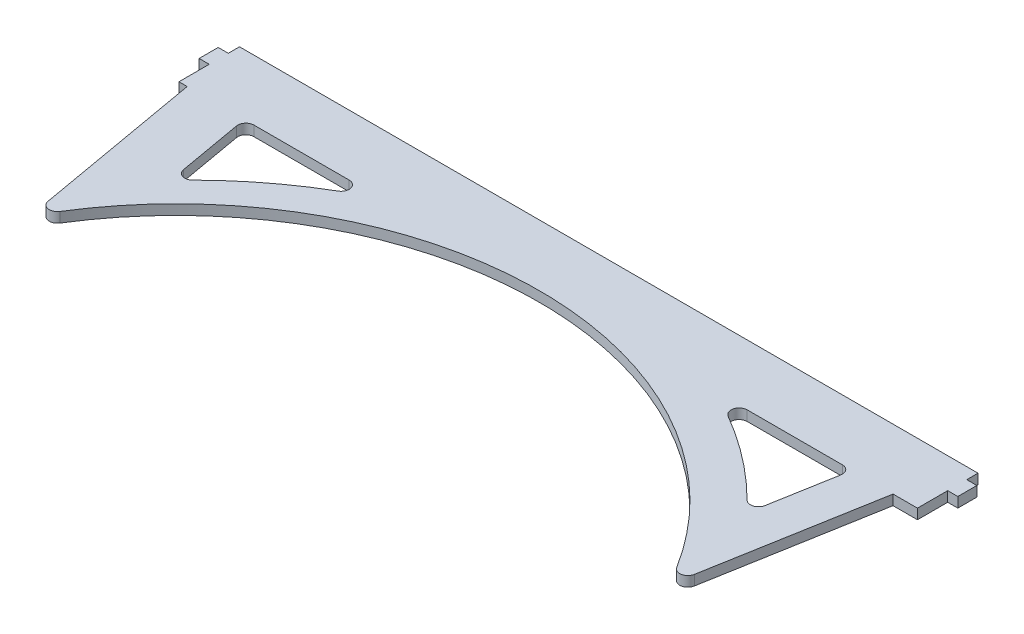
ISO-10303-21;
HEADER;
FILE_DESCRIPTION(('STEP AP214'),'2;1');
FILE_NAME('part.step','',(''),(''),'','','');
FILE_SCHEMA(('AUTOMOTIVE_DESIGN { 1 0 10303 214 1 1 1 1 }'));
ENDSEC;
DATA;
#1=APPLICATION_CONTEXT('core data for automotive mechanical design processes');
#2=APPLICATION_PROTOCOL_DEFINITION('international standard','automotive_design',2000,#1);
#3=PRODUCT_CONTEXT('',#1,'mechanical');
#4=PRODUCT('Part','Part','',(#3));
#5=PRODUCT_RELATED_PRODUCT_CATEGORY('part','',(#4));
#6=PRODUCT_DEFINITION_FORMATION('','',#4);
#7=PRODUCT_DEFINITION_CONTEXT('part definition',#1,'design');
#8=PRODUCT_DEFINITION('design','',#6,#7);
#9=PRODUCT_DEFINITION_SHAPE('','',#8);
#10=(LENGTH_UNIT() NAMED_UNIT(*) SI_UNIT(.MILLI.,.METRE.));
#11=(NAMED_UNIT(*) PLANE_ANGLE_UNIT() SI_UNIT($,.RADIAN.));
#12=(NAMED_UNIT(*) SI_UNIT($,.STERADIAN.) SOLID_ANGLE_UNIT());
#13=UNCERTAINTY_MEASURE_WITH_UNIT(LENGTH_MEASURE(1.E-05),#10,'distance_accuracy_value','');
#14=(GEOMETRIC_REPRESENTATION_CONTEXT(3) GLOBAL_UNCERTAINTY_ASSIGNED_CONTEXT((#13)) GLOBAL_UNIT_ASSIGNED_CONTEXT((#10,
#11,#12)) REPRESENTATION_CONTEXT('',''));
#15=CARTESIAN_POINT('',(0.,0.,0.));
#16=DIRECTION('',(0.,0.,1.));
#17=DIRECTION('',(1.,0.,0.));
#18=AXIS2_PLACEMENT_3D('',#15,#16,#17);
#19=CARTESIAN_POINT('',(333.375,3.175,9.52499999999996));
#20=DIRECTION('',(0.,0.,1.));
#21=DIRECTION('',(1.,0.,0.));
#22=AXIS2_PLACEMENT_3D('',#19,#20,#21);
#23=PLANE('',#22);
#24=DIRECTION('',(0.,1.,0.));
#25=VECTOR('',#24,1.);
#26=CARTESIAN_POINT('',(-113.550225532945,-229.971988758317,9.52499999999996));
#27=LINE('',#26,#25);
#28=CARTESIAN_POINT('',(-113.550225532945,0.,9.52500000000002));
#29=VERTEX_POINT('',#28);
#30=CARTESIAN_POINT('',(-113.550225532945,3.175,9.52499999999996));
#31=VERTEX_POINT('',#30);
#32=EDGE_CURVE('E435',#29,#31,#27,.T.);
#33=ORIENTED_EDGE('',*,*,#32,.T.);
#34=DIRECTION('',(-1.,0.,0.));
#35=VECTOR('',#34,1.);
#36=CARTESIAN_POINT('',(333.375,3.175,9.52499999999996));
#37=LINE('',#36,#35);
#38=CARTESIAN_POINT('',(-116.1415,3.175,9.52499999999996));
#39=VERTEX_POINT('',#38);
#40=EDGE_CURVE('E493',#31,#39,#37,.T.);
#41=ORIENTED_EDGE('',*,*,#40,.T.);
#42=DIRECTION('',(0.,-1.,0.));
#43=VECTOR('',#42,1.);
#44=CARTESIAN_POINT('',(-116.1415,3.175,9.52499999999996));
#45=LINE('',#44,#43);
#46=CARTESIAN_POINT('',(-116.1415,0.,9.52499999999996));
#47=VERTEX_POINT('',#46);
#48=EDGE_CURVE('E477',#39,#47,#45,.T.);
#49=ORIENTED_EDGE('',*,*,#48,.T.);
#50=DIRECTION('',(-1.,0.,0.));
#51=VECTOR('',#50,1.);
#52=CARTESIAN_POINT('',(333.375,0.,9.52499999999996));
#53=LINE('',#52,#51);
#54=EDGE_CURVE('E481',#29,#47,#53,.T.);
#55=ORIENTED_EDGE('',*,*,#54,.F.);
#56=EDGE_LOOP('',(#33,#41,#49,#55));
#57=FACE_BOUND('',#56,.T.);
#58=ADVANCED_FACE('F41',(#57),#23,.T.);
#59=DIRECTION('',(0.,1.,0.));
#60=VECTOR('',#59,1.);
#61=CARTESIAN_POINT('',(108.47022553296,-229.971988758317,9.52499999999996));
#62=LINE('',#61,#60);
#63=CARTESIAN_POINT('',(108.47022553296,0.,9.52499999999996));
#64=VERTEX_POINT('',#63);
#65=CARTESIAN_POINT('',(108.47022553296,3.175,9.52499999999996));
#66=VERTEX_POINT('',#65);
#67=EDGE_CURVE('E428',#64,#66,#62,.T.);
#68=ORIENTED_EDGE('',*,*,#67,.F.);
#69=CARTESIAN_POINT('',(116.1415,0.,9.52499999999999));
#70=VERTEX_POINT('',#69);
#71=EDGE_CURVE('E498',#70,#64,#53,.T.);
#72=ORIENTED_EDGE('',*,*,#71,.F.);
#73=DIRECTION('',(0.,-1.,0.));
#74=VECTOR('',#73,1.);
#75=CARTESIAN_POINT('',(116.1415,3.175,9.52499999999996));
#76=LINE('',#75,#74);
#77=CARTESIAN_POINT('',(116.1415,3.175,9.52499999999996));
#78=VERTEX_POINT('',#77);
#79=EDGE_CURVE('E447',#78,#70,#76,.T.);
#80=ORIENTED_EDGE('',*,*,#79,.F.);
#81=EDGE_CURVE('E488',#78,#66,#37,.T.);
#82=ORIENTED_EDGE('',*,*,#81,.T.);
#83=EDGE_LOOP('',(#68,#72,#80,#82));
#84=FACE_BOUND('',#83,.T.);
#85=ADVANCED_FACE('F546',(#84),#23,.T.);
#86=CARTESIAN_POINT('',(0.,3.175,0.));
#87=DIRECTION('',(0.,-1.,0.));
#88=DIRECTION('',(0.,0.,-1.));
#89=AXIS2_PLACEMENT_3D('',#86,#87,#88);
#90=PLANE('',#89);
#91=CARTESIAN_POINT('',(88.9711827002063,3.175,32.3459049542351));
#92=DIRECTION('',(0.,1.,0.));
#93=DIRECTION('',(0.,0.,1.));
#94=AXIS2_PLACEMENT_3D('',#91,#92,#93);
#95=CIRCLE('',#94,2.54);
#96=CARTESIAN_POINT('',(87.1768457845161,3.175,34.143668852246));
#97=VERTEX_POINT('',#96);
#98=CARTESIAN_POINT('',(91.4725943928573,3.175,32.7869713255091));
#99=VERTEX_POINT('',#98);
#100=EDGE_CURVE('E310',#97,#99,#95,.T.);
#101=ORIENTED_EDGE('',*,*,#100,.F.);
#102=CARTESIAN_POINT('',(-2.53999999999222,3.175,124.031863752793));
#103=DIRECTION('',(0.,-1.,0.));
#104=DIRECTION('',(0.,0.,1.));
#105=AXIS2_PLACEMENT_3D('',#102,#103,#104);
#106=CIRCLE('',#105,127.);
#107=CARTESIAN_POINT('',(61.328866019984,3.175,14.2604287010351));
#108=VERTEX_POINT('',#107);
#109=EDGE_CURVE('E307',#108,#97,#106,.T.);
#110=ORIENTED_EDGE('',*,*,#109,.F.);
#111=CARTESIAN_POINT('',(62.6062433403835,3.175,12.065));
#112=DIRECTION('',(0.,1.,0.));
#113=DIRECTION('',(0.,0.,-1.));
#114=AXIS2_PLACEMENT_3D('',#111,#112,#113);
#115=CIRCLE('',#114,2.53999999999999);
#116=CARTESIAN_POINT('',(62.6062433403835,3.175,9.52499999999996));
#117=VERTEX_POINT('',#116);
#118=EDGE_CURVE('E286',#117,#108,#115,.T.);
#119=ORIENTED_EDGE('',*,*,#118,.F.);
#120=DIRECTION('',(-1.,0.,0.));
#121=VECTOR('',#120,1.);
#122=CARTESIAN_POINT('',(92.5472534368218,3.175,9.52499999999996));
#123=LINE('',#122,#121);
#124=CARTESIAN_POINT('',(92.5472534368218,3.175,9.52499999999996));
#125=VERTEX_POINT('',#124);
#126=EDGE_CURVE('E323',#125,#117,#123,.T.);
#127=ORIENTED_EDGE('',*,*,#126,.F.);
#128=CARTESIAN_POINT('',(92.5472534368219,3.175,12.065));
#129=DIRECTION('',(0.,1.,0.));
#130=DIRECTION('',(0.,0.,-1.));
#131=AXIS2_PLACEMENT_3D('',#128,#129,#130);
#132=CIRCLE('',#131,2.54);
#133=CARTESIAN_POINT('',(95.0486651294729,3.175,12.506066371274));
#134=VERTEX_POINT('',#133);
#135=EDGE_CURVE('E319',#134,#125,#132,.T.);
#136=ORIENTED_EDGE('',*,*,#135,.F.);
#137=DIRECTION('',(0.173648177666927,0.,-0.984807753012209));
#138=VECTOR('',#137,1.);
#139=CARTESIAN_POINT('',(91.4725943928573,3.175,32.7869713255091));
#140=LINE('',#139,#138);
#141=EDGE_CURVE('E315',#99,#134,#140,.T.);
#142=ORIENTED_EDGE('',*,*,#141,.F.);
#143=EDGE_LOOP('',(#101,#110,#119,#127,#136,#142));
#144=FACE_BOUND('',#143,.T.);
#145=CARTESIAN_POINT('',(-62.6062433403835,3.175,12.0649999999997));
#146=DIRECTION('',(0.,1.,0.));
#147=DIRECTION('',(0.,0.,1.));
#148=AXIS2_PLACEMENT_3D('',#145,#146,#147);
#149=CIRCLE('',#148,2.53999999999999);
#150=CARTESIAN_POINT('',(-61.3288660199839,3.175,14.2604287010348));
#151=VERTEX_POINT('',#150);
#152=CARTESIAN_POINT('',(-62.6062433403835,3.175,9.52499999999969));
#153=VERTEX_POINT('',#152);
#154=EDGE_CURVE('E269',#151,#153,#149,.T.);
#155=ORIENTED_EDGE('',*,*,#154,.F.);
#156=CARTESIAN_POINT('',(2.53999999999177,3.175,124.031863752793));
#157=DIRECTION('',(0.,-1.,0.));
#158=DIRECTION('',(0.,0.,-1.));
#159=AXIS2_PLACEMENT_3D('',#156,#157,#158);
#160=CIRCLE('',#159,127.);
#161=CARTESIAN_POINT('',(-87.1768457845162,3.175,34.1436688522457));
#162=VERTEX_POINT('',#161);
#163=EDGE_CURVE('E264',#162,#151,#160,.T.);
#164=ORIENTED_EDGE('',*,*,#163,.F.);
#165=CARTESIAN_POINT('',(-88.9711827002064,3.175,32.3459049542347));
#166=DIRECTION('',(0.,1.,0.));
#167=DIRECTION('',(0.,0.,-1.));
#168=AXIS2_PLACEMENT_3D('',#165,#166,#167);
#169=CIRCLE('',#168,2.53999999999999);
#170=CARTESIAN_POINT('',(-91.4725943928573,3.175,32.7869713255091));
#171=VERTEX_POINT('',#170);
#172=EDGE_CURVE('E354',#171,#162,#169,.T.);
#173=ORIENTED_EDGE('',*,*,#172,.F.);
#174=DIRECTION('',(0.173648177666928,0.,0.984807753012208));
#175=VECTOR('',#174,1.);
#176=CARTESIAN_POINT('',(-91.4725943928573,3.175,32.7869713255091));
#177=LINE('',#176,#175);
#178=CARTESIAN_POINT('',(-95.0486651294729,3.175,12.506066371274));
#179=VERTEX_POINT('',#178);
#180=EDGE_CURVE('E386',#179,#171,#177,.T.);
#181=ORIENTED_EDGE('',*,*,#180,.F.);
#182=CARTESIAN_POINT('',(-92.5472534368218,3.175,12.0649999999996));
#183=DIRECTION('',(0.,1.,0.));
#184=DIRECTION('',(0.,0.,1.));
#185=AXIS2_PLACEMENT_3D('',#182,#183,#184);
#186=CIRCLE('',#185,2.54000000000006);
#187=CARTESIAN_POINT('',(-92.5472534368218,3.175,9.52499999999951));
#188=VERTEX_POINT('',#187);
#189=EDGE_CURVE('E382',#188,#179,#186,.T.);
#190=ORIENTED_EDGE('',*,*,#189,.F.);
#191=DIRECTION('',(-1.,0.,0.));
#192=VECTOR('',#191,1.);
#193=CARTESIAN_POINT('',(-92.5472534368218,3.175,9.52499999999957));
#194=LINE('',#193,#192);
#195=EDGE_CURVE('E378',#153,#188,#194,.T.);
#196=ORIENTED_EDGE('',*,*,#195,.F.);
#197=EDGE_LOOP('',(#155,#164,#173,#181,#190,#196));
#198=FACE_BOUND('',#197,.T.);
#199=DIRECTION('',(1.,0.,0.));
#200=VECTOR('',#199,1.);
#201=CARTESIAN_POINT('',(119.3165,3.175,-5.99248103000004));
#202=LINE('',#201,#200);
#203=CARTESIAN_POINT('',(116.1415,3.175,-5.99248103000004));
#204=VERTEX_POINT('',#203);
#205=CARTESIAN_POINT('',(119.3165,3.175,-5.99248103000004));
#206=VERTEX_POINT('',#205);
#207=EDGE_CURVE('E57',#204,#206,#202,.T.);
#208=ORIENTED_EDGE('',*,*,#207,.F.);
#209=DIRECTION('',(0.,0.,1.));
#210=VECTOR('',#209,1.);
#211=CARTESIAN_POINT('',(116.1415,3.175,-9.52500000000004));
#212=LINE('',#211,#210);
#213=CARTESIAN_POINT('',(116.1415,3.175,-9.52500000000004));
#214=VERTEX_POINT('',#213);
#215=EDGE_CURVE('E258',#214,#204,#212,.T.);
#216=ORIENTED_EDGE('',*,*,#215,.F.);
#217=DIRECTION('',(-1.,0.,0.));
#218=VECTOR('',#217,1.);
#219=CARTESIAN_POINT('',(333.375,3.175,-9.52500000000004));
#220=LINE('',#219,#218);
#221=CARTESIAN_POINT('',(-116.1415,3.175,-9.52500000000004));
#222=VERTEX_POINT('',#221);
#223=EDGE_CURVE('E492',#214,#222,#220,.T.);
#224=ORIENTED_EDGE('',*,*,#223,.T.);
#225=DIRECTION('',(0.,0.,-1.));
#226=VECTOR('',#225,1.);
#227=CARTESIAN_POINT('',(-116.1415,3.175,-9.52500000000004));
#228=LINE('',#227,#226);
#229=CARTESIAN_POINT('',(-116.1415,3.175,-5.99248103000004));
#230=VERTEX_POINT('',#229);
#231=EDGE_CURVE('E635',#230,#222,#228,.T.);
#232=ORIENTED_EDGE('',*,*,#231,.F.);
#233=DIRECTION('',(1.,0.,0.));
#234=VECTOR('',#233,1.);
#235=CARTESIAN_POINT('',(-119.3165,3.175,-5.99248103000004));
#236=LINE('',#235,#234);
#237=CARTESIAN_POINT('',(-119.3165,3.175,-5.99248103000004));
#238=VERTEX_POINT('',#237);
#239=EDGE_CURVE('E633',#238,#230,#236,.T.);
#240=ORIENTED_EDGE('',*,*,#239,.F.);
#241=DIRECTION('',(0.,0.,-1.));
#242=VECTOR('',#241,1.);
#243=CARTESIAN_POINT('',(-119.3165,3.175,9.52499999999996));
#244=LINE('',#243,#242);
#245=CARTESIAN_POINT('',(-119.3165,3.175,0.));
#246=VERTEX_POINT('',#245);
#247=EDGE_CURVE('E275',#246,#238,#244,.T.);
#248=ORIENTED_EDGE('',*,*,#247,.F.);
#249=DIRECTION('',(1.,0.,0.));
#250=VECTOR('',#249,1.);
#251=CARTESIAN_POINT('',(-119.3165,3.175,0.));
#252=LINE('',#251,#250);
#253=CARTESIAN_POINT('',(-116.1415,3.175,0.));
#254=VERTEX_POINT('',#253);
#255=EDGE_CURVE('E461',#246,#254,#252,.T.);
#256=ORIENTED_EDGE('',*,*,#255,.T.);
#257=DIRECTION('',(0.,0.,1.));
#258=VECTOR('',#257,1.);
#259=CARTESIAN_POINT('',(-116.1415,3.175,9.52499999999996));
#260=LINE('',#259,#258);
#261=EDGE_CURVE('E465',#254,#39,#260,.T.);
#262=ORIENTED_EDGE('',*,*,#261,.T.);
#263=ORIENTED_EDGE('',*,*,#40,.F.);
#264=DIRECTION('',(0.173648177666927,0.,0.984807753012209));
#265=VECTOR('',#264,1.);
#266=CARTESIAN_POINT('',(-113.550225532945,3.175,9.52499999999996));
#267=LINE('',#266,#265);
#268=CARTESIAN_POINT('',(-104.183394066714,3.175,62.6469410018584));
#269=VERTEX_POINT('',#268);
#270=EDGE_CURVE('E333',#31,#269,#267,.T.);
#271=ORIENTED_EDGE('',*,*,#270,.T.);
#272=CARTESIAN_POINT('',(-101.681982374063,3.17500000000001,62.2058746305844));
#273=DIRECTION('',(0.,-1.,0.));
#274=DIRECTION('',(0.,0.,-1.));
#275=AXIS2_PLACEMENT_3D('',#272,#273,#274);
#276=CIRCLE('',#275,2.54);
#277=CARTESIAN_POINT('',(-99.52672188767,3.175,63.5499178723715));
#278=VERTEX_POINT('',#277);
#279=EDGE_CURVE('E512',#269,#278,#276,.F.);
#280=ORIENTED_EDGE('',*,*,#279,.T.);
#281=CARTESIAN_POINT('',(-2.53999999999222,3.175,124.031863752793));
#282=DIRECTION('',(0.,-1.,0.));
#283=DIRECTION('',(0.,0.,1.));
#284=AXIS2_PLACEMENT_3D('',#281,#282,#283);
#285=CIRCLE('',#284,114.3);
#286=CARTESIAN_POINT('',(94.4467218876855,3.175,63.5499178723715));
#287=VERTEX_POINT('',#286);
#288=EDGE_CURVE('E414',#278,#287,#285,.T.);
#289=ORIENTED_EDGE('',*,*,#288,.T.);
#290=CARTESIAN_POINT('',(96.6019823740784,3.17500000000001,62.2058746305844));
#291=DIRECTION('',(0.,-1.,0.));
#292=DIRECTION('',(0.,0.,-1.));
#293=AXIS2_PLACEMENT_3D('',#290,#291,#292);
#294=CIRCLE('',#293,2.54);
#295=CARTESIAN_POINT('',(99.1033940667294,3.175,62.6469410018584));
#296=VERTEX_POINT('',#295);
#297=EDGE_CURVE('E515',#287,#296,#294,.F.);
#298=ORIENTED_EDGE('',*,*,#297,.T.);
#299=DIRECTION('',(0.173648177666927,0.,-0.984807753012209));
#300=VECTOR('',#299,1.);
#301=CARTESIAN_POINT('',(108.47022553296,3.175,9.52499999999996));
#302=LINE('',#301,#300);
#303=EDGE_CURVE('E410',#296,#66,#302,.T.);
#304=ORIENTED_EDGE('',*,*,#303,.T.);
#305=ORIENTED_EDGE('',*,*,#81,.F.);
#306=DIRECTION('',(0.,0.,1.));
#307=VECTOR('',#306,1.);
#308=CARTESIAN_POINT('',(116.1415,3.175,9.52499999999996));
#309=LINE('',#308,#307);
#310=CARTESIAN_POINT('',(116.1415,3.175,0.));
#311=VERTEX_POINT('',#310);
#312=EDGE_CURVE('E440',#311,#78,#309,.T.);
#313=ORIENTED_EDGE('',*,*,#312,.F.);
#314=DIRECTION('',(-1.,0.,0.));
#315=VECTOR('',#314,1.);
#316=CARTESIAN_POINT('',(119.3165,3.175,0.));
#317=LINE('',#316,#315);
#318=CARTESIAN_POINT('',(119.3165,3.175,0.));
#319=VERTEX_POINT('',#318);
#320=EDGE_CURVE('E443',#319,#311,#317,.T.);
#321=ORIENTED_EDGE('',*,*,#320,.F.);
#322=DIRECTION('',(0.,0.,1.));
#323=VECTOR('',#322,1.);
#324=CARTESIAN_POINT('',(119.3165,3.175,-9.52500000000004));
#325=LINE('',#324,#323);
#326=EDGE_CURVE('E265',#206,#319,#325,.T.);
#327=ORIENTED_EDGE('',*,*,#326,.F.);
#328=EDGE_LOOP('',(#208,#216,#224,#232,#240,#248,#256,#262,#263,#271,#280,#289,#298,#304,#305,
#313,#321,#327));
#329=FACE_BOUND('',#328,.T.);
#330=ADVANCED_FACE('F538',(#144,#198,#329),#90,.F.);
#331=CARTESIAN_POINT('',(0.,0.,0.));
#332=DIRECTION('',(0.,-1.,0.));
#333=DIRECTION('',(0.,0.,-1.));
#334=AXIS2_PLACEMENT_3D('',#331,#332,#333);
#335=PLANE('',#334);
#336=DIRECTION('',(0.,0.,-1.));
#337=VECTOR('',#336,1.);
#338=CARTESIAN_POINT('',(116.1415,0.,-9.52500000000004));
#339=LINE('',#338,#337);
#340=CARTESIAN_POINT('',(116.1415,0.,-5.99248103000004));
#341=VERTEX_POINT('',#340);
#342=CARTESIAN_POINT('',(116.1415,0.,-9.52500000000004));
#343=VERTEX_POINT('',#342);
#344=EDGE_CURVE('E247',#341,#343,#339,.T.);
#345=ORIENTED_EDGE('',*,*,#344,.F.);
#346=DIRECTION('',(-1.,0.,0.));
#347=VECTOR('',#346,1.);
#348=CARTESIAN_POINT('',(119.3165,0.,-5.99248103000004));
#349=LINE('',#348,#347);
#350=CARTESIAN_POINT('',(119.3165,0.,-5.99248103000004));
#351=VERTEX_POINT('',#350);
#352=EDGE_CURVE('E240',#351,#341,#349,.T.);
#353=ORIENTED_EDGE('',*,*,#352,.F.);
#354=DIRECTION('',(0.,0.,-1.));
#355=VECTOR('',#354,1.);
#356=CARTESIAN_POINT('',(119.3165,0.,-9.52500000000004));
#357=LINE('',#356,#355);
#358=CARTESIAN_POINT('',(119.3165,0.,0.));
#359=VERTEX_POINT('',#358);
#360=EDGE_CURVE('E254',#359,#351,#357,.T.);
#361=ORIENTED_EDGE('',*,*,#360,.F.);
#362=DIRECTION('',(-1.,0.,0.));
#363=VECTOR('',#362,1.);
#364=CARTESIAN_POINT('',(119.3165,0.,0.));
#365=LINE('',#364,#363);
#366=CARTESIAN_POINT('',(116.1415,0.,0.));
#367=VERTEX_POINT('',#366);
#368=EDGE_CURVE('E444',#359,#367,#365,.T.);
#369=ORIENTED_EDGE('',*,*,#368,.T.);
#370=DIRECTION('',(0.,0.,1.));
#371=VECTOR('',#370,1.);
#372=CARTESIAN_POINT('',(116.1415,0.,9.52499999999996));
#373=LINE('',#372,#371);
#374=EDGE_CURVE('E439',#367,#70,#373,.T.);
#375=ORIENTED_EDGE('',*,*,#374,.T.);
#376=ORIENTED_EDGE('',*,*,#71,.T.);
#377=DIRECTION('',(0.173648177666927,0.,-0.984807753012209));
#378=VECTOR('',#377,1.);
#379=CARTESIAN_POINT('',(108.47022553296,0.,9.52499999999996));
#380=LINE('',#379,#378);
#381=CARTESIAN_POINT('',(99.1033940667294,0.,62.6469410018584));
#382=VERTEX_POINT('',#381);
#383=EDGE_CURVE('E425',#382,#64,#380,.T.);
#384=ORIENTED_EDGE('',*,*,#383,.F.);
#385=CARTESIAN_POINT('',(96.6019823740784,0.,62.2058746305844));
#386=DIRECTION('',(0.,-1.,0.));
#387=DIRECTION('',(0.,0.,-1.));
#388=AXIS2_PLACEMENT_3D('',#385,#386,#387);
#389=CIRCLE('',#388,2.54);
#390=CARTESIAN_POINT('',(94.4467218876855,0.,63.5499178723715));
#391=VERTEX_POINT('',#390);
#392=EDGE_CURVE('E50',#382,#391,#389,.T.);
#393=ORIENTED_EDGE('',*,*,#392,.T.);
#394=CARTESIAN_POINT('',(-2.53999999999222,0.,124.031863752793));
#395=DIRECTION('',(0.,-1.,0.));
#396=DIRECTION('',(0.,0.,-1.));
#397=AXIS2_PLACEMENT_3D('',#394,#395,#396);
#398=CIRCLE('',#397,114.3);
#399=CARTESIAN_POINT('',(-99.52672188767,0.,63.5499178723715));
#400=VERTEX_POINT('',#399);
#401=EDGE_CURVE('E424',#400,#391,#398,.T.);
#402=ORIENTED_EDGE('',*,*,#401,.F.);
#403=CARTESIAN_POINT('',(-101.681982374063,0.,62.2058746305844));
#404=DIRECTION('',(0.,-1.,0.));
#405=DIRECTION('',(0.,0.,-1.));
#406=AXIS2_PLACEMENT_3D('',#403,#404,#405);
#407=CIRCLE('',#406,2.54);
#408=CARTESIAN_POINT('',(-104.183394066714,0.,62.6469410018584));
#409=VERTEX_POINT('',#408);
#410=EDGE_CURVE('E521',#400,#409,#407,.T.);
#411=ORIENTED_EDGE('',*,*,#410,.T.);
#412=DIRECTION('',(0.173648177666927,0.,0.984807753012209));
#413=VECTOR('',#412,1.);
#414=CARTESIAN_POINT('',(-113.550225532945,0.,9.52499999999996));
#415=LINE('',#414,#413);
#416=EDGE_CURVE('E413',#29,#409,#415,.T.);
#417=ORIENTED_EDGE('',*,*,#416,.F.);
#418=ORIENTED_EDGE('',*,*,#54,.T.);
#419=DIRECTION('',(0.,0.,1.));
#420=VECTOR('',#419,1.);
#421=CARTESIAN_POINT('',(-116.1415,0.,9.52499999999996));
#422=LINE('',#421,#420);
#423=CARTESIAN_POINT('',(-116.1415,0.,0.));
#424=VERTEX_POINT('',#423);
#425=EDGE_CURVE('E466',#424,#47,#422,.T.);
#426=ORIENTED_EDGE('',*,*,#425,.F.);
#427=DIRECTION('',(1.,0.,0.));
#428=VECTOR('',#427,1.);
#429=CARTESIAN_POINT('',(-119.3165,0.,0.));
#430=LINE('',#429,#428);
#431=CARTESIAN_POINT('',(-119.3165,0.,0.));
#432=VERTEX_POINT('',#431);
#433=EDGE_CURVE('E455',#432,#424,#430,.T.);
#434=ORIENTED_EDGE('',*,*,#433,.F.);
#435=DIRECTION('',(0.,0.,1.));
#436=VECTOR('',#435,1.);
#437=CARTESIAN_POINT('',(-119.3165,0.,-9.52500000000004));
#438=LINE('',#437,#436);
#439=CARTESIAN_POINT('',(-119.3165,0.,-5.99248103000004));
#440=VERTEX_POINT('',#439);
#441=EDGE_CURVE('E271',#440,#432,#438,.T.);
#442=ORIENTED_EDGE('',*,*,#441,.F.);
#443=DIRECTION('',(-1.,0.,0.));
#444=VECTOR('',#443,1.);
#445=CARTESIAN_POINT('',(-119.3165,0.,-5.99248103000004));
#446=LINE('',#445,#444);
#447=CARTESIAN_POINT('',(-116.1415,0.,-5.99248103000004));
#448=VERTEX_POINT('',#447);
#449=EDGE_CURVE('E65',#448,#440,#446,.T.);
#450=ORIENTED_EDGE('',*,*,#449,.F.);
#451=DIRECTION('',(0.,0.,1.));
#452=VECTOR('',#451,1.);
#453=CARTESIAN_POINT('',(-116.1415,0.,-9.52500000000004));
#454=LINE('',#453,#452);
#455=CARTESIAN_POINT('',(-116.1415,0.,-9.52500000000004));
#456=VERTEX_POINT('',#455);
#457=EDGE_CURVE('E631',#456,#448,#454,.T.);
#458=ORIENTED_EDGE('',*,*,#457,.F.);
#459=DIRECTION('',(-1.,0.,0.));
#460=VECTOR('',#459,1.);
#461=CARTESIAN_POINT('',(333.375,0.,-9.52500000000004));
#462=LINE('',#461,#460);
#463=EDGE_CURVE('E502',#343,#456,#462,.T.);
#464=ORIENTED_EDGE('',*,*,#463,.F.);
#465=EDGE_LOOP('',(#345,#353,#361,#369,#375,#376,#384,#393,#402,#411,#417,#418,#426,#434,#442,
#450,#458,#464));
#466=FACE_BOUND('',#465,.T.);
#467=CARTESIAN_POINT('',(-2.53999999999222,0.,124.031863752793));
#468=DIRECTION('',(0.,-1.,0.));
#469=DIRECTION('',(0.,0.,1.));
#470=AXIS2_PLACEMENT_3D('',#467,#468,#469);
#471=CIRCLE('',#470,127.);
#472=CARTESIAN_POINT('',(61.328866019984,0.,14.2604287010351));
#473=VERTEX_POINT('',#472);
#474=CARTESIAN_POINT('',(87.1768457845161,0.,34.143668852246));
#475=VERTEX_POINT('',#474);
#476=EDGE_CURVE('E281',#473,#475,#471,.T.);
#477=ORIENTED_EDGE('',*,*,#476,.T.);
#478=CARTESIAN_POINT('',(88.9711827002063,0.,32.3459049542351));
#479=DIRECTION('',(0.,1.,0.));
#480=DIRECTION('',(0.,0.,1.));
#481=AXIS2_PLACEMENT_3D('',#478,#479,#480);
#482=CIRCLE('',#481,2.54);
#483=CARTESIAN_POINT('',(91.4725943928573,0.,32.7869713255091));
#484=VERTEX_POINT('',#483);
#485=EDGE_CURVE('E285',#475,#484,#482,.T.);
#486=ORIENTED_EDGE('',*,*,#485,.T.);
#487=DIRECTION('',(0.173648177666927,0.,-0.984807753012209));
#488=VECTOR('',#487,1.);
#489=CARTESIAN_POINT('',(91.4725943928573,0.,32.7869713255091));
#490=LINE('',#489,#488);
#491=CARTESIAN_POINT('',(95.0486651294729,0.,12.506066371274));
#492=VERTEX_POINT('',#491);
#493=EDGE_CURVE('E290',#484,#492,#490,.T.);
#494=ORIENTED_EDGE('',*,*,#493,.T.);
#495=CARTESIAN_POINT('',(92.5472534368219,0.,12.065));
#496=DIRECTION('',(0.,1.,0.));
#497=DIRECTION('',(0.,0.,-1.));
#498=AXIS2_PLACEMENT_3D('',#495,#496,#497);
#499=CIRCLE('',#498,2.54);
#500=CARTESIAN_POINT('',(92.5472534368218,0.,9.52499999999996));
#501=VERTEX_POINT('',#500);
#502=EDGE_CURVE('E294',#492,#501,#499,.T.);
#503=ORIENTED_EDGE('',*,*,#502,.T.);
#504=DIRECTION('',(-1.,0.,0.));
#505=VECTOR('',#504,1.);
#506=CARTESIAN_POINT('',(92.5472534368218,0.,9.52499999999996));
#507=LINE('',#506,#505);
#508=CARTESIAN_POINT('',(62.6062433403835,0.,9.52499999999996));
#509=VERTEX_POINT('',#508);
#510=EDGE_CURVE('E298',#501,#509,#507,.T.);
#511=ORIENTED_EDGE('',*,*,#510,.T.);
#512=CARTESIAN_POINT('',(62.6062433403835,0.,12.065));
#513=DIRECTION('',(0.,1.,0.));
#514=DIRECTION('',(0.,0.,-1.));
#515=AXIS2_PLACEMENT_3D('',#512,#513,#514);
#516=CIRCLE('',#515,2.53999999999999);
#517=EDGE_CURVE('E302',#509,#473,#516,.T.);
#518=ORIENTED_EDGE('',*,*,#517,.T.);
#519=EDGE_LOOP('',(#477,#486,#494,#503,#511,#518));
#520=FACE_BOUND('',#519,.T.);
#521=CARTESIAN_POINT('',(2.53999999999177,0.,124.031863752793));
#522=DIRECTION('',(0.,-1.,0.));
#523=DIRECTION('',(0.,0.,-1.));
#524=AXIS2_PLACEMENT_3D('',#521,#522,#523);
#525=CIRCLE('',#524,127.);
#526=CARTESIAN_POINT('',(-87.1768457845162,0.,34.1436688522457));
#527=VERTEX_POINT('',#526);
#528=CARTESIAN_POINT('',(-61.3288660199839,0.,14.2604287010348));
#529=VERTEX_POINT('',#528);
#530=EDGE_CURVE('E349',#527,#529,#525,.T.);
#531=ORIENTED_EDGE('',*,*,#530,.T.);
#532=CARTESIAN_POINT('',(-62.6062433403835,0.,12.0649999999997));
#533=DIRECTION('',(0.,1.,0.));
#534=DIRECTION('',(0.,0.,1.));
#535=AXIS2_PLACEMENT_3D('',#532,#533,#534);
#536=CIRCLE('',#535,2.53999999999999);
#537=CARTESIAN_POINT('',(-62.6062433403835,0.,9.5249999999997));
#538=VERTEX_POINT('',#537);
#539=EDGE_CURVE('E353',#529,#538,#536,.T.);
#540=ORIENTED_EDGE('',*,*,#539,.T.);
#541=DIRECTION('',(-1.,0.,0.));
#542=VECTOR('',#541,1.);
#543=CARTESIAN_POINT('',(-92.5472534368218,0.,9.52499999999957));
#544=LINE('',#543,#542);
#545=CARTESIAN_POINT('',(-92.5472534368218,0.,9.52499999999951));
#546=VERTEX_POINT('',#545);
#547=EDGE_CURVE('E358',#538,#546,#544,.T.);
#548=ORIENTED_EDGE('',*,*,#547,.T.);
#549=CARTESIAN_POINT('',(-92.5472534368218,0.,12.0649999999996));
#550=DIRECTION('',(0.,1.,0.));
#551=DIRECTION('',(0.,0.,1.));
#552=AXIS2_PLACEMENT_3D('',#549,#550,#551);
#553=CIRCLE('',#552,2.54000000000006);
#554=CARTESIAN_POINT('',(-95.0486651294729,0.,12.506066371274));
#555=VERTEX_POINT('',#554);
#556=EDGE_CURVE('E362',#546,#555,#553,.T.);
#557=ORIENTED_EDGE('',*,*,#556,.T.);
#558=DIRECTION('',(0.173648177666928,0.,0.984807753012208));
#559=VECTOR('',#558,1.);
#560=CARTESIAN_POINT('',(-91.4725943928573,0.,32.7869713255091));
#561=LINE('',#560,#559);
#562=CARTESIAN_POINT('',(-91.4725943928573,0.,32.7869713255091));
#563=VERTEX_POINT('',#562);
#564=EDGE_CURVE('E366',#555,#563,#561,.T.);
#565=ORIENTED_EDGE('',*,*,#564,.T.);
#566=CARTESIAN_POINT('',(-88.9711827002064,0.,32.3459049542347));
#567=DIRECTION('',(0.,1.,0.));
#568=DIRECTION('',(0.,0.,-1.));
#569=AXIS2_PLACEMENT_3D('',#566,#567,#568);
#570=CIRCLE('',#569,2.53999999999999);
#571=EDGE_CURVE('E370',#563,#527,#570,.T.);
#572=ORIENTED_EDGE('',*,*,#571,.T.);
#573=EDGE_LOOP('',(#531,#540,#548,#557,#565,#572));
#574=FACE_BOUND('',#573,.T.);
#575=ADVANCED_FACE('F251',(#466,#520,#574),#335,.T.);
#576=CARTESIAN_POINT('',(333.375,3.175,-9.52500000000004));
#577=DIRECTION('',(0.,0.,1.));
#578=DIRECTION('',(1.,0.,0.));
#579=AXIS2_PLACEMENT_3D('',#576,#577,#578);
#580=PLANE('',#579);
#581=ORIENTED_EDGE('',*,*,#223,.F.);
#582=DIRECTION('',(0.,-1.,0.));
#583=VECTOR('',#582,1.);
#584=CARTESIAN_POINT('',(116.1415,3.176,-9.52500000000004));
#585=LINE('',#584,#583);
#586=EDGE_CURVE('E641',#214,#343,#585,.T.);
#587=ORIENTED_EDGE('',*,*,#586,.T.);
#588=ORIENTED_EDGE('',*,*,#463,.T.);
#589=DIRECTION('',(0.,-1.,0.));
#590=VECTOR('',#589,1.);
#591=CARTESIAN_POINT('',(-116.1415,3.176,-9.52500000000004));
#592=LINE('',#591,#590);
#593=EDGE_CURVE('E622',#222,#456,#592,.T.);
#594=ORIENTED_EDGE('',*,*,#593,.F.);
#595=EDGE_LOOP('',(#581,#587,#588,#594));
#596=FACE_BOUND('',#595,.T.);
#597=ADVANCED_FACE('F575',(#596),#580,.F.);
#598=CARTESIAN_POINT('',(-116.1415,3.175,9.52499999999996));
#599=DIRECTION('',(1.,0.,0.));
#600=DIRECTION('',(0.,0.,-1.));
#601=AXIS2_PLACEMENT_3D('',#598,#599,#600);
#602=PLANE('',#601);
#603=ORIENTED_EDGE('',*,*,#425,.T.);
#604=ORIENTED_EDGE('',*,*,#48,.F.);
#605=ORIENTED_EDGE('',*,*,#261,.F.);
#606=DIRECTION('',(0.,-1.,0.));
#607=VECTOR('',#606,1.);
#608=CARTESIAN_POINT('',(-116.1415,3.175,0.));
#609=LINE('',#608,#607);
#610=EDGE_CURVE('E482',#254,#424,#609,.T.);
#611=ORIENTED_EDGE('',*,*,#610,.T.);
#612=EDGE_LOOP('',(#603,#604,#605,#611));
#613=FACE_BOUND('',#612,.T.);
#614=ADVANCED_FACE('F564',(#613),#602,.F.);
#615=CARTESIAN_POINT('',(-119.3165,3.175,0.));
#616=DIRECTION('',(0.,0.,-1.));
#617=DIRECTION('',(-1.,0.,0.));
#618=AXIS2_PLACEMENT_3D('',#615,#616,#617);
#619=PLANE('',#618);
#620=ORIENTED_EDGE('',*,*,#433,.T.);
#621=ORIENTED_EDGE('',*,*,#610,.F.);
#622=ORIENTED_EDGE('',*,*,#255,.F.);
#623=DIRECTION('',(0.,-1.,0.));
#624=VECTOR('',#623,1.);
#625=CARTESIAN_POINT('',(-119.3165,3.175,0.));
#626=LINE('',#625,#624);
#627=EDGE_CURVE('E470',#246,#432,#626,.T.);
#628=ORIENTED_EDGE('',*,*,#627,.T.);
#629=EDGE_LOOP('',(#620,#621,#622,#628));
#630=FACE_BOUND('',#629,.T.);
#631=ADVANCED_FACE('F556',(#630),#619,.F.);
#632=CARTESIAN_POINT('',(119.3165,3.175,0.));
#633=DIRECTION('',(0.,0.,1.));
#634=DIRECTION('',(1.,0.,0.));
#635=AXIS2_PLACEMENT_3D('',#632,#633,#634);
#636=PLANE('',#635);
#637=ORIENTED_EDGE('',*,*,#368,.F.);
#638=DIRECTION('',(0.,-1.,0.));
#639=VECTOR('',#638,1.);
#640=CARTESIAN_POINT('',(119.3165,3.175,0.));
#641=LINE('',#640,#639);
#642=EDGE_CURVE('E262',#319,#359,#641,.T.);
#643=ORIENTED_EDGE('',*,*,#642,.F.);
#644=ORIENTED_EDGE('',*,*,#320,.T.);
#645=DIRECTION('',(0.,-1.,0.));
#646=VECTOR('',#645,1.);
#647=CARTESIAN_POINT('',(116.1415,3.175,0.));
#648=LINE('',#647,#646);
#649=EDGE_CURVE('E456',#311,#367,#648,.T.);
#650=ORIENTED_EDGE('',*,*,#649,.T.);
#651=EDGE_LOOP('',(#637,#643,#644,#650));
#652=FACE_BOUND('',#651,.T.);
#653=ADVANCED_FACE('F554',(#652),#636,.T.);
#654=CARTESIAN_POINT('',(116.1415,3.175,9.52499999999996));
#655=DIRECTION('',(1.,0.,0.));
#656=DIRECTION('',(0.,0.,-1.));
#657=AXIS2_PLACEMENT_3D('',#654,#655,#656);
#658=PLANE('',#657);
#659=ORIENTED_EDGE('',*,*,#374,.F.);
#660=ORIENTED_EDGE('',*,*,#649,.F.);
#661=ORIENTED_EDGE('',*,*,#312,.T.);
#662=ORIENTED_EDGE('',*,*,#79,.T.);
#663=EDGE_LOOP('',(#659,#660,#661,#662));
#664=FACE_BOUND('',#663,.T.);
#665=ADVANCED_FACE('F552',(#664),#658,.T.);
#666=CARTESIAN_POINT('',(-113.550225532945,-229.971988758317,9.52499999999996));
#667=DIRECTION('',(-0.984807753012209,0.,0.173648177666927));
#668=DIRECTION('',(0.173648177666927,0.,0.984807753012209));
#669=AXIS2_PLACEMENT_3D('',#666,#667,#668);
#670=PLANE('',#669);
#671=ORIENTED_EDGE('',*,*,#416,.T.);
#672=DIRECTION('',(0.,1.,0.));
#673=VECTOR('',#672,1.);
#674=CARTESIAN_POINT('',(-104.183394066714,-229.971988758317,62.6469410018584));
#675=LINE('',#674,#673);
#676=EDGE_CURVE('E11',#409,#269,#675,.T.);
#677=ORIENTED_EDGE('',*,*,#676,.T.);
#678=ORIENTED_EDGE('',*,*,#270,.F.);
#679=ORIENTED_EDGE('',*,*,#32,.F.);
#680=EDGE_LOOP('',(#671,#677,#678,#679));
#681=FACE_BOUND('',#680,.T.);
#682=ADVANCED_FACE('F562',(#681),#670,.T.);
#683=CARTESIAN_POINT('',(-2.53999999999222,-229.971988758317,124.031863752793));
#684=DIRECTION('',(0.,1.,0.));
#685=DIRECTION('',(0.,0.,1.));
#686=AXIS2_PLACEMENT_3D('',#683,#684,#685);
#687=CYLINDRICAL_SURFACE('',#686,114.3);
#688=ORIENTED_EDGE('',*,*,#401,.T.);
#689=DIRECTION('',(0.,1.,0.));
#690=VECTOR('',#689,1.);
#691=CARTESIAN_POINT('',(94.4467218876855,-229.971988758317,63.5499178723715));
#692=LINE('',#691,#690);
#693=EDGE_CURVE('E508',#391,#287,#692,.T.);
#694=ORIENTED_EDGE('',*,*,#693,.T.);
#695=ORIENTED_EDGE('',*,*,#288,.F.);
#696=DIRECTION('',(0.,1.,0.));
#697=VECTOR('',#696,1.);
#698=CARTESIAN_POINT('',(-99.52672188767,-229.971988758317,63.5499178723715));
#699=LINE('',#698,#697);
#700=EDGE_CURVE('E497',#278,#400,#699,.F.);
#701=ORIENTED_EDGE('',*,*,#700,.T.);
#702=EDGE_LOOP('',(#688,#694,#695,#701));
#703=FACE_BOUND('',#702,.T.);
#704=ADVANCED_FACE('F532',(#703),#687,.F.);
#705=CARTESIAN_POINT('',(108.47022553296,-229.971988758317,9.52499999999996));
#706=DIRECTION('',(0.984807753012209,0.,0.173648177666927));
#707=DIRECTION('',(0.173648177666927,0.,-0.984807753012209));
#708=AXIS2_PLACEMENT_3D('',#705,#706,#707);
#709=PLANE('',#708);
#710=ORIENTED_EDGE('',*,*,#303,.F.);
#711=DIRECTION('',(0.,1.,0.));
#712=VECTOR('',#711,1.);
#713=CARTESIAN_POINT('',(99.1033940667294,-229.971988758317,62.6469410018584));
#714=LINE('',#713,#712);
#715=EDGE_CURVE('E518',#296,#382,#714,.F.);
#716=ORIENTED_EDGE('',*,*,#715,.T.);
#717=ORIENTED_EDGE('',*,*,#383,.T.);
#718=ORIENTED_EDGE('',*,*,#67,.T.);
#719=EDGE_LOOP('',(#710,#716,#717,#718));
#720=FACE_BOUND('',#719,.T.);
#721=ADVANCED_FACE('F541',(#720),#709,.T.);
#722=CARTESIAN_POINT('',(96.6019823740784,-229.971988758317,62.2058746305844));
#723=DIRECTION('',(0.,1.,0.));
#724=DIRECTION('',(0.,0.,1.));
#725=AXIS2_PLACEMENT_3D('',#722,#723,#724);
#726=CYLINDRICAL_SURFACE('',#725,2.54);
#727=ORIENTED_EDGE('',*,*,#392,.F.);
#728=ORIENTED_EDGE('',*,*,#715,.F.);
#729=ORIENTED_EDGE('',*,*,#297,.F.);
#730=ORIENTED_EDGE('',*,*,#693,.F.);
#731=EDGE_LOOP('',(#727,#728,#729,#730));
#732=FACE_BOUND('',#731,.T.);
#733=ADVANCED_FACE('F535',(#732),#726,.T.);
#734=CARTESIAN_POINT('',(-101.681982374063,-229.971988758317,62.2058746305844));
#735=DIRECTION('',(0.,1.,0.));
#736=DIRECTION('',(0.,0.,1.));
#737=AXIS2_PLACEMENT_3D('',#734,#735,#736);
#738=CYLINDRICAL_SURFACE('',#737,2.54);
#739=ORIENTED_EDGE('',*,*,#410,.F.);
#740=ORIENTED_EDGE('',*,*,#700,.F.);
#741=ORIENTED_EDGE('',*,*,#279,.F.);
#742=ORIENTED_EDGE('',*,*,#676,.F.);
#743=EDGE_LOOP('',(#739,#740,#741,#742));
#744=FACE_BOUND('',#743,.T.);
#745=ADVANCED_FACE('F43',(#744),#738,.T.);
#746=CARTESIAN_POINT('',(2.53999999999177,0.,124.031863752793));
#747=DIRECTION('',(0.,1.,0.));
#748=DIRECTION('',(0.,0.,1.));
#749=AXIS2_PLACEMENT_3D('',#746,#747,#748);
#750=CYLINDRICAL_SURFACE('',#749,127.);
#751=ORIENTED_EDGE('',*,*,#163,.T.);
#752=DIRECTION('',(0.,1.,0.));
#753=VECTOR('',#752,1.);
#754=CARTESIAN_POINT('',(-61.3288660199839,0.,14.2604287010348));
#755=LINE('',#754,#753);
#756=EDGE_CURVE('E373',#529,#151,#755,.T.);
#757=ORIENTED_EDGE('',*,*,#756,.F.);
#758=ORIENTED_EDGE('',*,*,#530,.F.);
#759=DIRECTION('',(0.,1.,0.));
#760=VECTOR('',#759,1.);
#761=CARTESIAN_POINT('',(-87.1768457845162,0.,34.1436688522457));
#762=LINE('',#761,#760);
#763=EDGE_CURVE('E311',#527,#162,#762,.T.);
#764=ORIENTED_EDGE('',*,*,#763,.T.);
#765=EDGE_LOOP('',(#751,#757,#758,#764));
#766=FACE_BOUND('',#765,.T.);
#767=ADVANCED_FACE('F582',(#766),#750,.T.);
#768=CARTESIAN_POINT('',(-88.9711827002064,0.,32.3459049542347));
#769=DIRECTION('',(0.,1.,0.));
#770=DIRECTION('',(0.,0.,1.));
#771=AXIS2_PLACEMENT_3D('',#768,#769,#770);
#772=CYLINDRICAL_SURFACE('',#771,2.53999999999999);
#773=ORIENTED_EDGE('',*,*,#172,.T.);
#774=ORIENTED_EDGE('',*,*,#763,.F.);
#775=ORIENTED_EDGE('',*,*,#571,.F.);
#776=DIRECTION('',(0.,1.,0.));
#777=VECTOR('',#776,1.);
#778=CARTESIAN_POINT('',(-91.4725943928573,0.,32.7869713255091));
#779=LINE('',#778,#777);
#780=EDGE_CURVE('E395',#563,#171,#779,.T.);
#781=ORIENTED_EDGE('',*,*,#780,.T.);
#782=EDGE_LOOP('',(#773,#774,#775,#781));
#783=FACE_BOUND('',#782,.T.);
#784=ADVANCED_FACE('F695',(#783),#772,.F.);
#785=CARTESIAN_POINT('',(-91.4725943928573,0.,32.7869713255091));
#786=DIRECTION('',(-0.984807753012208,0.,0.173648177666928));
#787=DIRECTION('',(0.173648177666928,0.,0.984807753012208));
#788=AXIS2_PLACEMENT_3D('',#785,#786,#787);
#789=PLANE('',#788);
#790=ORIENTED_EDGE('',*,*,#180,.T.);
#791=ORIENTED_EDGE('',*,*,#780,.F.);
#792=ORIENTED_EDGE('',*,*,#564,.F.);
#793=DIRECTION('',(0.,1.,0.));
#794=VECTOR('',#793,1.);
#795=CARTESIAN_POINT('',(-95.0486651294729,0.,12.506066371274));
#796=LINE('',#795,#794);
#797=EDGE_CURVE('E398',#555,#179,#796,.T.);
#798=ORIENTED_EDGE('',*,*,#797,.T.);
#799=EDGE_LOOP('',(#790,#791,#792,#798));
#800=FACE_BOUND('',#799,.T.);
#801=ADVANCED_FACE('F698',(#800),#789,.F.);
#802=CARTESIAN_POINT('',(-92.5472534368218,0.,12.0649999999996));
#803=DIRECTION('',(0.,1.,0.));
#804=DIRECTION('',(0.,0.,1.));
#805=AXIS2_PLACEMENT_3D('',#802,#803,#804);
#806=CYLINDRICAL_SURFACE('',#805,2.54000000000006);
#807=ORIENTED_EDGE('',*,*,#189,.T.);
#808=ORIENTED_EDGE('',*,*,#797,.F.);
#809=ORIENTED_EDGE('',*,*,#556,.F.);
#810=DIRECTION('',(0.,1.,0.));
#811=VECTOR('',#810,1.);
#812=CARTESIAN_POINT('',(-92.5472534368218,0.,9.52499999999951));
#813=LINE('',#812,#811);
#814=EDGE_CURVE('E401',#546,#188,#813,.T.);
#815=ORIENTED_EDGE('',*,*,#814,.T.);
#816=EDGE_LOOP('',(#807,#808,#809,#815));
#817=FACE_BOUND('',#816,.T.);
#818=ADVANCED_FACE('F702',(#817),#806,.F.);
#819=CARTESIAN_POINT('',(-92.5472534368218,0.,9.52499999999957));
#820=DIRECTION('',(0.,0.,-1.));
#821=DIRECTION('',(-1.,0.,0.));
#822=AXIS2_PLACEMENT_3D('',#819,#820,#821);
#823=PLANE('',#822);
#824=ORIENTED_EDGE('',*,*,#195,.T.);
#825=ORIENTED_EDGE('',*,*,#814,.F.);
#826=ORIENTED_EDGE('',*,*,#547,.F.);
#827=DIRECTION('',(0.,1.,0.));
#828=VECTOR('',#827,1.);
#829=CARTESIAN_POINT('',(-62.6062433403835,0.,9.52499999999969));
#830=LINE('',#829,#828);
#831=EDGE_CURVE('E404',#538,#153,#830,.T.);
#832=ORIENTED_EDGE('',*,*,#831,.T.);
#833=EDGE_LOOP('',(#824,#825,#826,#832));
#834=FACE_BOUND('',#833,.T.);
#835=ADVANCED_FACE('F706',(#834),#823,.F.);
#836=CARTESIAN_POINT('',(-62.6062433403835,0.,12.0649999999997));
#837=DIRECTION('',(0.,1.,0.));
#838=DIRECTION('',(0.,0.,1.));
#839=AXIS2_PLACEMENT_3D('',#836,#837,#838);
#840=CYLINDRICAL_SURFACE('',#839,2.53999999999999);
#841=ORIENTED_EDGE('',*,*,#154,.T.);
#842=ORIENTED_EDGE('',*,*,#831,.F.);
#843=ORIENTED_EDGE('',*,*,#539,.F.);
#844=ORIENTED_EDGE('',*,*,#756,.T.);
#845=EDGE_LOOP('',(#841,#842,#843,#844));
#846=FACE_BOUND('',#845,.T.);
#847=ADVANCED_FACE('F693',(#846),#840,.F.);
#848=CARTESIAN_POINT('',(-2.53999999999222,0.,124.031863752793));
#849=DIRECTION('',(0.,1.,0.));
#850=DIRECTION('',(0.,0.,1.));
#851=AXIS2_PLACEMENT_3D('',#848,#849,#850);
#852=CYLINDRICAL_SURFACE('',#851,127.);
#853=ORIENTED_EDGE('',*,*,#109,.T.);
#854=DIRECTION('',(0.,1.,0.));
#855=VECTOR('',#854,1.);
#856=CARTESIAN_POINT('',(87.1768457845161,0.,34.143668852246));
#857=LINE('',#856,#855);
#858=EDGE_CURVE('E306',#475,#97,#857,.T.);
#859=ORIENTED_EDGE('',*,*,#858,.F.);
#860=ORIENTED_EDGE('',*,*,#476,.F.);
#861=DIRECTION('',(0.,1.,0.));
#862=VECTOR('',#861,1.);
#863=CARTESIAN_POINT('',(61.328866019984,0.,14.2604287010351));
#864=LINE('',#863,#862);
#865=EDGE_CURVE('E330',#473,#108,#864,.T.);
#866=ORIENTED_EDGE('',*,*,#865,.T.);
#867=EDGE_LOOP('',(#853,#859,#860,#866));
#868=FACE_BOUND('',#867,.T.);
#869=ADVANCED_FACE('F675',(#868),#852,.T.);
#870=CARTESIAN_POINT('',(62.6062433403835,0.,12.065));
#871=DIRECTION('',(0.,1.,0.));
#872=DIRECTION('',(0.,0.,1.));
#873=AXIS2_PLACEMENT_3D('',#870,#871,#872);
#874=CYLINDRICAL_SURFACE('',#873,2.53999999999999);
#875=ORIENTED_EDGE('',*,*,#118,.T.);
#876=ORIENTED_EDGE('',*,*,#865,.F.);
#877=ORIENTED_EDGE('',*,*,#517,.F.);
#878=DIRECTION('',(0.,1.,0.));
#879=VECTOR('',#878,1.);
#880=CARTESIAN_POINT('',(62.6062433403835,0.,9.52499999999996));
#881=LINE('',#880,#879);
#882=EDGE_CURVE('E334',#509,#117,#881,.T.);
#883=ORIENTED_EDGE('',*,*,#882,.T.);
#884=EDGE_LOOP('',(#875,#876,#877,#883));
#885=FACE_BOUND('',#884,.T.);
#886=ADVANCED_FACE('F671',(#885),#874,.F.);
#887=CARTESIAN_POINT('',(92.5472534368218,0.,9.52499999999996));
#888=DIRECTION('',(0.,0.,-1.));
#889=DIRECTION('',(-1.,0.,0.));
#890=AXIS2_PLACEMENT_3D('',#887,#888,#889);
#891=PLANE('',#890);
#892=ORIENTED_EDGE('',*,*,#126,.T.);
#893=ORIENTED_EDGE('',*,*,#882,.F.);
#894=ORIENTED_EDGE('',*,*,#510,.F.);
#895=DIRECTION('',(0.,1.,0.));
#896=VECTOR('',#895,1.);
#897=CARTESIAN_POINT('',(92.5472534368218,0.,9.52499999999996));
#898=LINE('',#897,#896);
#899=EDGE_CURVE('E337',#501,#125,#898,.T.);
#900=ORIENTED_EDGE('',*,*,#899,.T.);
#901=EDGE_LOOP('',(#892,#893,#894,#900));
#902=FACE_BOUND('',#901,.T.);
#903=ADVANCED_FACE('F674',(#902),#891,.F.);
#904=CARTESIAN_POINT('',(92.5472534368219,0.,12.065));
#905=DIRECTION('',(0.,1.,0.));
#906=DIRECTION('',(0.,0.,1.));
#907=AXIS2_PLACEMENT_3D('',#904,#905,#906);
#908=CYLINDRICAL_SURFACE('',#907,2.54);
#909=ORIENTED_EDGE('',*,*,#135,.T.);
#910=ORIENTED_EDGE('',*,*,#899,.F.);
#911=ORIENTED_EDGE('',*,*,#502,.F.);
#912=DIRECTION('',(0.,1.,0.));
#913=VECTOR('',#912,1.);
#914=CARTESIAN_POINT('',(95.0486651294729,0.,12.506066371274));
#915=LINE('',#914,#913);
#916=EDGE_CURVE('E340',#492,#134,#915,.T.);
#917=ORIENTED_EDGE('',*,*,#916,.T.);
#918=EDGE_LOOP('',(#909,#910,#911,#917));
#919=FACE_BOUND('',#918,.T.);
#920=ADVANCED_FACE('F679',(#919),#908,.F.);
#921=CARTESIAN_POINT('',(91.4725943928573,0.,32.7869713255091));
#922=DIRECTION('',(0.984807753012209,0.,0.173648177666927));
#923=DIRECTION('',(0.173648177666927,0.,-0.984807753012209));
#924=AXIS2_PLACEMENT_3D('',#921,#922,#923);
#925=PLANE('',#924);
#926=ORIENTED_EDGE('',*,*,#141,.T.);
#927=ORIENTED_EDGE('',*,*,#916,.F.);
#928=ORIENTED_EDGE('',*,*,#493,.F.);
#929=DIRECTION('',(0.,1.,0.));
#930=VECTOR('',#929,1.);
#931=CARTESIAN_POINT('',(91.4725943928573,0.,32.7869713255091));
#932=LINE('',#931,#930);
#933=EDGE_CURVE('E343',#484,#99,#932,.T.);
#934=ORIENTED_EDGE('',*,*,#933,.T.);
#935=EDGE_LOOP('',(#926,#927,#928,#934));
#936=FACE_BOUND('',#935,.T.);
#937=ADVANCED_FACE('F683',(#936),#925,.F.);
#938=CARTESIAN_POINT('',(88.9711827002063,0.,32.3459049542351));
#939=DIRECTION('',(0.,1.,0.));
#940=DIRECTION('',(0.,0.,1.));
#941=AXIS2_PLACEMENT_3D('',#938,#939,#940);
#942=CYLINDRICAL_SURFACE('',#941,2.54);
#943=ORIENTED_EDGE('',*,*,#100,.T.);
#944=ORIENTED_EDGE('',*,*,#933,.F.);
#945=ORIENTED_EDGE('',*,*,#485,.F.);
#946=ORIENTED_EDGE('',*,*,#858,.T.);
#947=EDGE_LOOP('',(#943,#944,#945,#946));
#948=FACE_BOUND('',#947,.T.);
#949=ADVANCED_FACE('F669',(#948),#942,.F.);
#950=CARTESIAN_POINT('',(119.3165,3.176,-9.52500000000004));
#951=DIRECTION('',(-1.,0.,0.));
#952=DIRECTION('',(0.,0.,1.));
#953=AXIS2_PLACEMENT_3D('',#950,#951,#952);
#954=PLANE('',#953);
#955=ORIENTED_EDGE('',*,*,#360,.T.);
#956=DIRECTION('',(0.,-1.,0.));
#957=VECTOR('',#956,1.);
#958=CARTESIAN_POINT('',(119.3165,3.176,-5.99248103000004));
#959=LINE('',#958,#957);
#960=EDGE_CURVE('E237',#206,#351,#959,.T.);
#961=ORIENTED_EDGE('',*,*,#960,.F.);
#962=ORIENTED_EDGE('',*,*,#326,.T.);
#963=ORIENTED_EDGE('',*,*,#642,.T.);
#964=EDGE_LOOP('',(#955,#961,#962,#963));
#965=FACE_BOUND('',#964,.T.);
#966=ADVANCED_FACE('F260',(#965),#954,.F.);
#967=CARTESIAN_POINT('',(-119.3165,3.176,-9.52500000000004));
#968=DIRECTION('',(1.,0.,0.));
#969=DIRECTION('',(0.,0.,-1.));
#970=AXIS2_PLACEMENT_3D('',#967,#968,#969);
#971=PLANE('',#970);
#972=ORIENTED_EDGE('',*,*,#247,.T.);
#973=DIRECTION('',(0.,-1.,0.));
#974=VECTOR('',#973,1.);
#975=CARTESIAN_POINT('',(-119.3165,3.176,-5.99248103000004));
#976=LINE('',#975,#974);
#977=EDGE_CURVE('E612',#238,#440,#976,.T.);
#978=ORIENTED_EDGE('',*,*,#977,.T.);
#979=ORIENTED_EDGE('',*,*,#441,.T.);
#980=ORIENTED_EDGE('',*,*,#627,.F.);
#981=EDGE_LOOP('',(#972,#978,#979,#980));
#982=FACE_BOUND('',#981,.T.);
#983=ADVANCED_FACE('F610',(#982),#971,.F.);
#984=CARTESIAN_POINT('',(-119.3165,3.176,-5.99248103000004));
#985=DIRECTION('',(0.,0.,1.));
#986=DIRECTION('',(1.,0.,0.));
#987=AXIS2_PLACEMENT_3D('',#984,#985,#986);
#988=PLANE('',#987);
#989=ORIENTED_EDGE('',*,*,#239,.T.);
#990=DIRECTION('',(0.,-1.,0.));
#991=VECTOR('',#990,1.);
#992=CARTESIAN_POINT('',(-116.1415,3.176,-5.99248103000004));
#993=LINE('',#992,#991);
#994=EDGE_CURVE('E616',#230,#448,#993,.T.);
#995=ORIENTED_EDGE('',*,*,#994,.T.);
#996=ORIENTED_EDGE('',*,*,#449,.T.);
#997=ORIENTED_EDGE('',*,*,#977,.F.);
#998=EDGE_LOOP('',(#989,#995,#996,#997));
#999=FACE_BOUND('',#998,.T.);
#1000=ADVANCED_FACE('F656',(#999),#988,.F.);
#1001=CARTESIAN_POINT('',(-116.1415,3.176,-9.52500000000004));
#1002=DIRECTION('',(1.,0.,0.));
#1003=DIRECTION('',(0.,0.,-1.));
#1004=AXIS2_PLACEMENT_3D('',#1001,#1002,#1003);
#1005=PLANE('',#1004);
#1006=ORIENTED_EDGE('',*,*,#231,.T.);
#1007=ORIENTED_EDGE('',*,*,#593,.T.);
#1008=ORIENTED_EDGE('',*,*,#457,.T.);
#1009=ORIENTED_EDGE('',*,*,#994,.F.);
#1010=EDGE_LOOP('',(#1006,#1007,#1008,#1009));
#1011=FACE_BOUND('',#1010,.T.);
#1012=ADVANCED_FACE('F655',(#1011),#1005,.F.);
#1013=CARTESIAN_POINT('',(116.1415,3.176,-9.52500000000004));
#1014=DIRECTION('',(-1.,0.,0.));
#1015=DIRECTION('',(0.,0.,1.));
#1016=AXIS2_PLACEMENT_3D('',#1013,#1014,#1015);
#1017=PLANE('',#1016);
#1018=ORIENTED_EDGE('',*,*,#215,.T.);
#1019=DIRECTION('',(0.,-1.,0.));
#1020=VECTOR('',#1019,1.);
#1021=CARTESIAN_POINT('',(116.1415,3.176,-5.99248103000004));
#1022=LINE('',#1021,#1020);
#1023=EDGE_CURVE('E246',#204,#341,#1022,.T.);
#1024=ORIENTED_EDGE('',*,*,#1023,.T.);
#1025=ORIENTED_EDGE('',*,*,#344,.T.);
#1026=ORIENTED_EDGE('',*,*,#586,.F.);
#1027=EDGE_LOOP('',(#1018,#1024,#1025,#1026));
#1028=FACE_BOUND('',#1027,.T.);
#1029=ADVANCED_FACE('F650',(#1028),#1017,.F.);
#1030=CARTESIAN_POINT('',(119.3165,3.176,-5.99248103000004));
#1031=DIRECTION('',(0.,0.,1.));
#1032=DIRECTION('',(1.,0.,0.));
#1033=AXIS2_PLACEMENT_3D('',#1030,#1031,#1032);
#1034=PLANE('',#1033);
#1035=ORIENTED_EDGE('',*,*,#207,.T.);
#1036=ORIENTED_EDGE('',*,*,#960,.T.);
#1037=ORIENTED_EDGE('',*,*,#352,.T.);
#1038=ORIENTED_EDGE('',*,*,#1023,.F.);
#1039=EDGE_LOOP('',(#1035,#1036,#1037,#1038));
#1040=FACE_BOUND('',#1039,.T.);
#1041=ADVANCED_FACE('F239',(#1040),#1034,.F.);
#1042=CLOSED_SHELL('',(#58,#85,#330,#575,#597,#614,#631,#653,#665,#682,#704,#721,#733,#745,#767,
#784,#801,#818,#835,#847,#869,#886,#903,#920,#937,#949,#966,#983,#1000,#1012,#1029,#1041));
#1043=MANIFOLD_SOLID_BREP('B2',#1042);
#1044=ADVANCED_BREP_SHAPE_REPRESENTATION('',(#18,#1043),#14);
#1045=SHAPE_DEFINITION_REPRESENTATION(#9,#1044);
ENDSEC;
END-ISO-10303-21;
